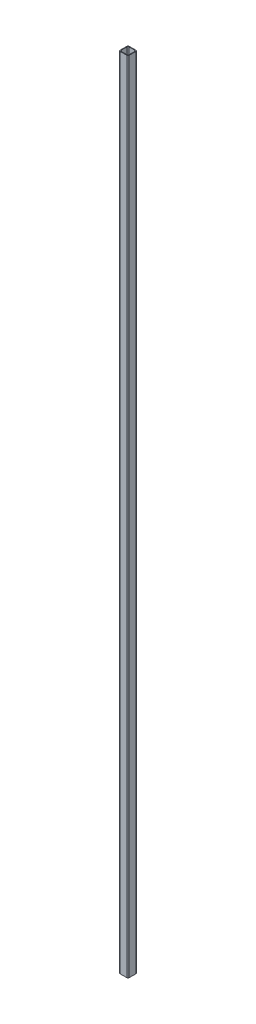
ISO-10303-21;
HEADER;
FILE_DESCRIPTION(('STEP AP214'),'2;1');
FILE_NAME('part.step','',(''),(''),'','','');
FILE_SCHEMA(('AUTOMOTIVE_DESIGN { 1 0 10303 214 1 1 1 1 }'));
ENDSEC;
DATA;
#1=APPLICATION_CONTEXT('core data for automotive mechanical design processes');
#2=APPLICATION_PROTOCOL_DEFINITION('international standard','automotive_design',2000,#1);
#3=PRODUCT_CONTEXT('',#1,'mechanical');
#4=PRODUCT('Part','Part','',(#3));
#5=PRODUCT_RELATED_PRODUCT_CATEGORY('part','',(#4));
#6=PRODUCT_DEFINITION_FORMATION('','',#4);
#7=PRODUCT_DEFINITION_CONTEXT('part definition',#1,'design');
#8=PRODUCT_DEFINITION('design','',#6,#7);
#9=PRODUCT_DEFINITION_SHAPE('','',#8);
#10=(LENGTH_UNIT() NAMED_UNIT(*) SI_UNIT(.MILLI.,.METRE.));
#11=(NAMED_UNIT(*) PLANE_ANGLE_UNIT() SI_UNIT($,.RADIAN.));
#12=(NAMED_UNIT(*) SI_UNIT($,.STERADIAN.) SOLID_ANGLE_UNIT());
#13=UNCERTAINTY_MEASURE_WITH_UNIT(LENGTH_MEASURE(1.E-05),#10,'distance_accuracy_value','');
#14=(GEOMETRIC_REPRESENTATION_CONTEXT(3) GLOBAL_UNCERTAINTY_ASSIGNED_CONTEXT((#13)) GLOBAL_UNIT_ASSIGNED_CONTEXT((#10,
#11,#12)) REPRESENTATION_CONTEXT('',''));
#15=CARTESIAN_POINT('',(0.,0.,0.));
#16=DIRECTION('',(0.,0.,1.));
#17=DIRECTION('',(1.,0.,0.));
#18=AXIS2_PLACEMENT_3D('',#15,#16,#17);
#19=CARTESIAN_POINT('',(-3.,715.,-3.));
#20=DIRECTION('',(0.,-1.,0.));
#21=DIRECTION('',(0.,0.,1.));
#22=AXIS2_PLACEMENT_3D('',#19,#20,#21);
#23=PLANE('',#22);
#24=CARTESIAN_POINT('',(-3.,715.,-3.));
#25=DIRECTION('',(0.,-1.,0.));
#26=DIRECTION('',(0.,0.,1.));
#27=AXIS2_PLACEMENT_3D('',#24,#25,#26);
#28=CIRCLE('',#27,1.);
#29=CARTESIAN_POINT('',(-4.,715.,-3.));
#30=VERTEX_POINT('',#29);
#31=CARTESIAN_POINT('',(-3.,715.,-4.));
#32=VERTEX_POINT('',#31);
#33=EDGE_CURVE('E217',#30,#32,#28,.T.);
#34=ORIENTED_EDGE('',*,*,#33,.F.);
#35=DIRECTION('',(0.,0.,-1.));
#36=VECTOR('',#35,1.);
#37=CARTESIAN_POINT('',(-4.,715.,-3.));
#38=LINE('',#37,#36);
#39=CARTESIAN_POINT('',(-4.,715.,3.));
#40=VERTEX_POINT('',#39);
#41=EDGE_CURVE('E239',#40,#30,#38,.T.);
#42=ORIENTED_EDGE('',*,*,#41,.F.);
#43=CARTESIAN_POINT('',(-3.,715.,3.));
#44=DIRECTION('',(0.,-1.,0.));
#45=DIRECTION('',(0.,0.,1.));
#46=AXIS2_PLACEMENT_3D('',#43,#44,#45);
#47=CIRCLE('',#46,1.);
#48=CARTESIAN_POINT('',(-3.,715.,4.));
#49=VERTEX_POINT('',#48);
#50=EDGE_CURVE('E236',#49,#40,#47,.T.);
#51=ORIENTED_EDGE('',*,*,#50,.F.);
#52=DIRECTION('',(-1.,0.,0.));
#53=VECTOR('',#52,1.);
#54=CARTESIAN_POINT('',(-3.,715.,4.));
#55=LINE('',#54,#53);
#56=CARTESIAN_POINT('',(3.,715.,4.));
#57=VERTEX_POINT('',#56);
#58=EDGE_CURVE('E233',#57,#49,#55,.T.);
#59=ORIENTED_EDGE('',*,*,#58,.F.);
#60=CARTESIAN_POINT('',(3.,715.,3.));
#61=DIRECTION('',(0.,-1.,0.));
#62=DIRECTION('',(0.,0.,1.));
#63=AXIS2_PLACEMENT_3D('',#60,#61,#62);
#64=CIRCLE('',#63,1.);
#65=CARTESIAN_POINT('',(4.,715.,3.));
#66=VERTEX_POINT('',#65);
#67=EDGE_CURVE('E230',#66,#57,#64,.T.);
#68=ORIENTED_EDGE('',*,*,#67,.F.);
#69=DIRECTION('',(0.,0.,1.));
#70=VECTOR('',#69,1.);
#71=CARTESIAN_POINT('',(4.,715.,-3.));
#72=LINE('',#71,#70);
#73=CARTESIAN_POINT('',(4.,715.,-3.));
#74=VERTEX_POINT('',#73);
#75=EDGE_CURVE('E227',#74,#66,#72,.T.);
#76=ORIENTED_EDGE('',*,*,#75,.F.);
#77=CARTESIAN_POINT('',(3.,715.,-3.));
#78=DIRECTION('',(0.,-1.,0.));
#79=DIRECTION('',(0.,0.,-1.));
#80=AXIS2_PLACEMENT_3D('',#77,#78,#79);
#81=CIRCLE('',#80,1.);
#82=CARTESIAN_POINT('',(3.,715.,-4.));
#83=VERTEX_POINT('',#82);
#84=EDGE_CURVE('E224',#83,#74,#81,.T.);
#85=ORIENTED_EDGE('',*,*,#84,.F.);
#86=DIRECTION('',(1.,0.,0.));
#87=VECTOR('',#86,1.);
#88=CARTESIAN_POINT('',(-3.,715.,-4.));
#89=LINE('',#88,#87);
#90=EDGE_CURVE('E220',#32,#83,#89,.T.);
#91=ORIENTED_EDGE('',*,*,#90,.F.);
#92=EDGE_LOOP('',(#34,#42,#51,#59,#68,#76,#85,#91));
#93=FACE_BOUND('',#92,.T.);
#94=CARTESIAN_POINT('',(-2.5,715.,-2.5));
#95=DIRECTION('',(0.,-1.,0.));
#96=DIRECTION('',(0.,0.,1.));
#97=AXIS2_PLACEMENT_3D('',#94,#95,#96);
#98=CIRCLE('',#97,1.);
#99=CARTESIAN_POINT('',(-3.5,715.,-2.5));
#100=VERTEX_POINT('',#99);
#101=CARTESIAN_POINT('',(-2.5,715.,-3.5));
#102=VERTEX_POINT('',#101);
#103=EDGE_CURVE('E152',#100,#102,#98,.T.);
#104=ORIENTED_EDGE('',*,*,#103,.T.);
#105=DIRECTION('',(1.,0.,0.));
#106=VECTOR('',#105,1.);
#107=CARTESIAN_POINT('',(-2.5,715.,-3.5));
#108=LINE('',#107,#106);
#109=CARTESIAN_POINT('',(2.5,715.,-3.5));
#110=VERTEX_POINT('',#109);
#111=EDGE_CURVE('E161',#102,#110,#108,.T.);
#112=ORIENTED_EDGE('',*,*,#111,.T.);
#113=CARTESIAN_POINT('',(2.5,715.,-2.5));
#114=DIRECTION('',(0.,-1.,0.));
#115=DIRECTION('',(0.,0.,-1.));
#116=AXIS2_PLACEMENT_3D('',#113,#114,#115);
#117=CIRCLE('',#116,1.);
#118=CARTESIAN_POINT('',(3.5,715.,-2.5));
#119=VERTEX_POINT('',#118);
#120=EDGE_CURVE('E166',#110,#119,#117,.T.);
#121=ORIENTED_EDGE('',*,*,#120,.T.);
#122=DIRECTION('',(0.,0.,1.));
#123=VECTOR('',#122,1.);
#124=CARTESIAN_POINT('',(3.5,715.,-2.5));
#125=LINE('',#124,#123);
#126=CARTESIAN_POINT('',(3.5,715.,2.5));
#127=VERTEX_POINT('',#126);
#128=EDGE_CURVE('E178',#119,#127,#125,.T.);
#129=ORIENTED_EDGE('',*,*,#128,.T.);
#130=CARTESIAN_POINT('',(2.5,715.,2.5));
#131=DIRECTION('',(0.,-1.,0.));
#132=DIRECTION('',(0.,0.,1.));
#133=AXIS2_PLACEMENT_3D('',#130,#131,#132);
#134=CIRCLE('',#133,1.);
#135=CARTESIAN_POINT('',(2.5,715.,3.5));
#136=VERTEX_POINT('',#135);
#137=EDGE_CURVE('E181',#127,#136,#134,.T.);
#138=ORIENTED_EDGE('',*,*,#137,.T.);
#139=DIRECTION('',(-1.,0.,0.));
#140=VECTOR('',#139,1.);
#141=CARTESIAN_POINT('',(-2.5,715.,3.5));
#142=LINE('',#141,#140);
#143=CARTESIAN_POINT('',(-2.5,715.,3.5));
#144=VERTEX_POINT('',#143);
#145=EDGE_CURVE('E184',#136,#144,#142,.T.);
#146=ORIENTED_EDGE('',*,*,#145,.T.);
#147=CARTESIAN_POINT('',(-2.5,715.,2.5));
#148=DIRECTION('',(0.,-1.,0.));
#149=DIRECTION('',(0.,0.,1.));
#150=AXIS2_PLACEMENT_3D('',#147,#148,#149);
#151=CIRCLE('',#150,1.);
#152=CARTESIAN_POINT('',(-3.5,715.,2.5));
#153=VERTEX_POINT('',#152);
#154=EDGE_CURVE('E187',#144,#153,#151,.T.);
#155=ORIENTED_EDGE('',*,*,#154,.T.);
#156=DIRECTION('',(0.,0.,-1.));
#157=VECTOR('',#156,1.);
#158=CARTESIAN_POINT('',(-3.5,715.,-2.5));
#159=LINE('',#158,#157);
#160=EDGE_CURVE('E170',#153,#100,#159,.T.);
#161=ORIENTED_EDGE('',*,*,#160,.T.);
#162=EDGE_LOOP('',(#104,#112,#121,#129,#138,#146,#155,#161));
#163=FACE_BOUND('',#162,.T.);
#164=ADVANCED_FACE('F37',(#93,#163),#23,.F.);
#165=CARTESIAN_POINT('',(-3.,0.,-3.));
#166=DIRECTION('',(0.,-1.,0.));
#167=DIRECTION('',(0.,0.,1.));
#168=AXIS2_PLACEMENT_3D('',#165,#166,#167);
#169=PLANE('',#168);
#170=CARTESIAN_POINT('',(-3.,0.,-3.));
#171=DIRECTION('',(0.,-1.,0.));
#172=DIRECTION('',(0.,0.,1.));
#173=AXIS2_PLACEMENT_3D('',#170,#171,#172);
#174=CIRCLE('',#173,1.);
#175=CARTESIAN_POINT('',(-4.,0.,-3.));
#176=VERTEX_POINT('',#175);
#177=CARTESIAN_POINT('',(-3.,0.,-4.));
#178=VERTEX_POINT('',#177);
#179=EDGE_CURVE('E157',#176,#178,#174,.T.);
#180=ORIENTED_EDGE('',*,*,#179,.T.);
#181=DIRECTION('',(1.,0.,0.));
#182=VECTOR('',#181,1.);
#183=CARTESIAN_POINT('',(-3.,0.,-4.));
#184=LINE('',#183,#182);
#185=CARTESIAN_POINT('',(3.,0.,-4.));
#186=VERTEX_POINT('',#185);
#187=EDGE_CURVE('E245',#178,#186,#184,.T.);
#188=ORIENTED_EDGE('',*,*,#187,.T.);
#189=CARTESIAN_POINT('',(3.,0.,-3.));
#190=DIRECTION('',(0.,-1.,0.));
#191=DIRECTION('',(0.,0.,-1.));
#192=AXIS2_PLACEMENT_3D('',#189,#190,#191);
#193=CIRCLE('',#192,1.);
#194=CARTESIAN_POINT('',(4.,0.,-3.));
#195=VERTEX_POINT('',#194);
#196=EDGE_CURVE('E248',#186,#195,#193,.T.);
#197=ORIENTED_EDGE('',*,*,#196,.T.);
#198=DIRECTION('',(0.,0.,1.));
#199=VECTOR('',#198,1.);
#200=CARTESIAN_POINT('',(4.,0.,-3.));
#201=LINE('',#200,#199);
#202=CARTESIAN_POINT('',(4.,0.,3.));
#203=VERTEX_POINT('',#202);
#204=EDGE_CURVE('E251',#195,#203,#201,.T.);
#205=ORIENTED_EDGE('',*,*,#204,.T.);
#206=CARTESIAN_POINT('',(3.,0.,3.));
#207=DIRECTION('',(0.,-1.,0.));
#208=DIRECTION('',(0.,0.,1.));
#209=AXIS2_PLACEMENT_3D('',#206,#207,#208);
#210=CIRCLE('',#209,1.);
#211=CARTESIAN_POINT('',(3.,0.,4.));
#212=VERTEX_POINT('',#211);
#213=EDGE_CURVE('E254',#203,#212,#210,.T.);
#214=ORIENTED_EDGE('',*,*,#213,.T.);
#215=DIRECTION('',(-1.,0.,0.));
#216=VECTOR('',#215,1.);
#217=CARTESIAN_POINT('',(-3.,0.,4.));
#218=LINE('',#217,#216);
#219=CARTESIAN_POINT('',(-3.,0.,4.));
#220=VERTEX_POINT('',#219);
#221=EDGE_CURVE('E257',#212,#220,#218,.T.);
#222=ORIENTED_EDGE('',*,*,#221,.T.);
#223=CARTESIAN_POINT('',(-3.,0.,3.));
#224=DIRECTION('',(0.,-1.,0.));
#225=DIRECTION('',(0.,0.,1.));
#226=AXIS2_PLACEMENT_3D('',#223,#224,#225);
#227=CIRCLE('',#226,1.);
#228=CARTESIAN_POINT('',(-4.,0.,3.));
#229=VERTEX_POINT('',#228);
#230=EDGE_CURVE('E260',#220,#229,#227,.T.);
#231=ORIENTED_EDGE('',*,*,#230,.T.);
#232=DIRECTION('',(0.,0.,-1.));
#233=VECTOR('',#232,1.);
#234=CARTESIAN_POINT('',(-4.,0.,-3.));
#235=LINE('',#234,#233);
#236=EDGE_CURVE('E221',#229,#176,#235,.T.);
#237=ORIENTED_EDGE('',*,*,#236,.T.);
#238=EDGE_LOOP('',(#180,#188,#197,#205,#214,#222,#231,#237));
#239=FACE_BOUND('',#238,.T.);
#240=DIRECTION('',(0.,0.,-1.));
#241=VECTOR('',#240,1.);
#242=CARTESIAN_POINT('',(-3.5,0.,-2.5));
#243=LINE('',#242,#241);
#244=CARTESIAN_POINT('',(-3.5,0.,2.5));
#245=VERTEX_POINT('',#244);
#246=CARTESIAN_POINT('',(-3.5,0.,-2.5));
#247=VERTEX_POINT('',#246);
#248=EDGE_CURVE('E171',#245,#247,#243,.T.);
#249=ORIENTED_EDGE('',*,*,#248,.F.);
#250=CARTESIAN_POINT('',(-2.5,0.,2.5));
#251=DIRECTION('',(0.,-1.,0.));
#252=DIRECTION('',(0.,0.,1.));
#253=AXIS2_PLACEMENT_3D('',#250,#251,#252);
#254=CIRCLE('',#253,1.);
#255=CARTESIAN_POINT('',(-2.5,0.,3.5));
#256=VERTEX_POINT('',#255);
#257=EDGE_CURVE('E174',#256,#245,#254,.T.);
#258=ORIENTED_EDGE('',*,*,#257,.F.);
#259=DIRECTION('',(-1.,0.,0.));
#260=VECTOR('',#259,1.);
#261=CARTESIAN_POINT('',(-2.5,0.,3.5));
#262=LINE('',#261,#260);
#263=CARTESIAN_POINT('',(2.5,0.,3.5));
#264=VERTEX_POINT('',#263);
#265=EDGE_CURVE('E202',#264,#256,#262,.T.);
#266=ORIENTED_EDGE('',*,*,#265,.F.);
#267=CARTESIAN_POINT('',(2.5,0.,2.5));
#268=DIRECTION('',(0.,-1.,0.));
#269=DIRECTION('',(0.,0.,1.));
#270=AXIS2_PLACEMENT_3D('',#267,#268,#269);
#271=CIRCLE('',#270,1.);
#272=CARTESIAN_POINT('',(3.5,0.,2.5));
#273=VERTEX_POINT('',#272);
#274=EDGE_CURVE('E199',#273,#264,#271,.T.);
#275=ORIENTED_EDGE('',*,*,#274,.F.);
#276=DIRECTION('',(0.,0.,1.));
#277=VECTOR('',#276,1.);
#278=CARTESIAN_POINT('',(3.5,0.,-2.5));
#279=LINE('',#278,#277);
#280=CARTESIAN_POINT('',(3.5,0.,-2.5));
#281=VERTEX_POINT('',#280);
#282=EDGE_CURVE('E196',#281,#273,#279,.T.);
#283=ORIENTED_EDGE('',*,*,#282,.F.);
#284=CARTESIAN_POINT('',(2.5,0.,-2.5));
#285=DIRECTION('',(0.,-1.,0.));
#286=DIRECTION('',(0.,0.,-1.));
#287=AXIS2_PLACEMENT_3D('',#284,#285,#286);
#288=CIRCLE('',#287,1.);
#289=CARTESIAN_POINT('',(2.5,0.,-3.5));
#290=VERTEX_POINT('',#289);
#291=EDGE_CURVE('E193',#290,#281,#288,.T.);
#292=ORIENTED_EDGE('',*,*,#291,.F.);
#293=DIRECTION('',(1.,0.,0.));
#294=VECTOR('',#293,1.);
#295=CARTESIAN_POINT('',(-2.5,0.,-3.5));
#296=LINE('',#295,#294);
#297=CARTESIAN_POINT('',(-2.5,0.,-3.5));
#298=VERTEX_POINT('',#297);
#299=EDGE_CURVE('E191',#298,#290,#296,.T.);
#300=ORIENTED_EDGE('',*,*,#299,.F.);
#301=CARTESIAN_POINT('',(-2.5,0.,-2.5));
#302=DIRECTION('',(0.,-1.,0.));
#303=DIRECTION('',(0.,0.,1.));
#304=AXIS2_PLACEMENT_3D('',#301,#302,#303);
#305=CIRCLE('',#304,1.);
#306=EDGE_CURVE('E153',#247,#298,#305,.T.);
#307=ORIENTED_EDGE('',*,*,#306,.F.);
#308=EDGE_LOOP('',(#249,#258,#266,#275,#283,#292,#300,#307));
#309=FACE_BOUND('',#308,.T.);
#310=ADVANCED_FACE('F285',(#239,#309),#169,.T.);
#311=CARTESIAN_POINT('',(-3.,715.,-3.));
#312=DIRECTION('',(0.,-1.,0.));
#313=DIRECTION('',(0.,0.,1.));
#314=AXIS2_PLACEMENT_3D('',#311,#312,#313);
#315=CYLINDRICAL_SURFACE('',#314,1.);
#316=ORIENTED_EDGE('',*,*,#179,.F.);
#317=DIRECTION('',(0.,-1.,0.));
#318=VECTOR('',#317,1.);
#319=CARTESIAN_POINT('',(-4.,715.,-3.));
#320=LINE('',#319,#318);
#321=EDGE_CURVE('E242',#30,#176,#320,.T.);
#322=ORIENTED_EDGE('',*,*,#321,.F.);
#323=ORIENTED_EDGE('',*,*,#33,.T.);
#324=DIRECTION('',(0.,-1.,0.));
#325=VECTOR('',#324,1.);
#326=CARTESIAN_POINT('',(-3.,715.,-4.));
#327=LINE('',#326,#325);
#328=EDGE_CURVE('E11',#32,#178,#327,.T.);
#329=ORIENTED_EDGE('',*,*,#328,.T.);
#330=EDGE_LOOP('',(#316,#322,#323,#329));
#331=FACE_BOUND('',#330,.T.);
#332=ADVANCED_FACE('F39',(#331),#315,.T.);
#333=CARTESIAN_POINT('',(-3.,715.,-4.));
#334=DIRECTION('',(0.,0.,1.));
#335=DIRECTION('',(-1.,0.,0.));
#336=AXIS2_PLACEMENT_3D('',#333,#334,#335);
#337=PLANE('',#336);
#338=ORIENTED_EDGE('',*,*,#187,.F.);
#339=ORIENTED_EDGE('',*,*,#328,.F.);
#340=ORIENTED_EDGE('',*,*,#90,.T.);
#341=DIRECTION('',(0.,-1.,0.));
#342=VECTOR('',#341,1.);
#343=CARTESIAN_POINT('',(3.,715.,-4.));
#344=LINE('',#343,#342);
#345=EDGE_CURVE('E45',#83,#186,#344,.T.);
#346=ORIENTED_EDGE('',*,*,#345,.T.);
#347=EDGE_LOOP('',(#338,#339,#340,#346));
#348=FACE_BOUND('',#347,.T.);
#349=ADVANCED_FACE('F278',(#348),#337,.F.);
#350=CARTESIAN_POINT('',(3.,715.,-3.));
#351=DIRECTION('',(0.,-1.,0.));
#352=DIRECTION('',(0.,0.,1.));
#353=AXIS2_PLACEMENT_3D('',#350,#351,#352);
#354=CYLINDRICAL_SURFACE('',#353,1.);
#355=ORIENTED_EDGE('',*,*,#196,.F.);
#356=ORIENTED_EDGE('',*,*,#345,.F.);
#357=ORIENTED_EDGE('',*,*,#84,.T.);
#358=DIRECTION('',(0.,-1.,0.));
#359=VECTOR('',#358,1.);
#360=CARTESIAN_POINT('',(4.,715.,-3.));
#361=LINE('',#360,#359);
#362=EDGE_CURVE('E274',#74,#195,#361,.T.);
#363=ORIENTED_EDGE('',*,*,#362,.T.);
#364=EDGE_LOOP('',(#355,#356,#357,#363));
#365=FACE_BOUND('',#364,.T.);
#366=ADVANCED_FACE('F282',(#365),#354,.T.);
#367=CARTESIAN_POINT('',(4.,715.,-3.));
#368=DIRECTION('',(-1.,0.,0.));
#369=DIRECTION('',(0.,0.,-1.));
#370=AXIS2_PLACEMENT_3D('',#367,#368,#369);
#371=PLANE('',#370);
#372=ORIENTED_EDGE('',*,*,#204,.F.);
#373=ORIENTED_EDGE('',*,*,#362,.F.);
#374=ORIENTED_EDGE('',*,*,#75,.T.);
#375=DIRECTION('',(0.,-1.,0.));
#376=VECTOR('',#375,1.);
#377=CARTESIAN_POINT('',(4.,715.,3.));
#378=LINE('',#377,#376);
#379=EDGE_CURVE('E272',#66,#203,#378,.T.);
#380=ORIENTED_EDGE('',*,*,#379,.T.);
#381=EDGE_LOOP('',(#372,#373,#374,#380));
#382=FACE_BOUND('',#381,.T.);
#383=ADVANCED_FACE('F297',(#382),#371,.F.);
#384=CARTESIAN_POINT('',(3.,715.,3.));
#385=DIRECTION('',(0.,-1.,0.));
#386=DIRECTION('',(0.,0.,1.));
#387=AXIS2_PLACEMENT_3D('',#384,#385,#386);
#388=CYLINDRICAL_SURFACE('',#387,1.);
#389=ORIENTED_EDGE('',*,*,#213,.F.);
#390=ORIENTED_EDGE('',*,*,#379,.F.);
#391=ORIENTED_EDGE('',*,*,#67,.T.);
#392=DIRECTION('',(0.,-1.,0.));
#393=VECTOR('',#392,1.);
#394=CARTESIAN_POINT('',(3.,715.,4.));
#395=LINE('',#394,#393);
#396=EDGE_CURVE('E270',#57,#212,#395,.T.);
#397=ORIENTED_EDGE('',*,*,#396,.T.);
#398=EDGE_LOOP('',(#389,#390,#391,#397));
#399=FACE_BOUND('',#398,.T.);
#400=ADVANCED_FACE('F301',(#399),#388,.T.);
#401=CARTESIAN_POINT('',(-3.,715.,4.));
#402=DIRECTION('',(0.,0.,-1.));
#403=DIRECTION('',(1.,0.,0.));
#404=AXIS2_PLACEMENT_3D('',#401,#402,#403);
#405=PLANE('',#404);
#406=ORIENTED_EDGE('',*,*,#221,.F.);
#407=ORIENTED_EDGE('',*,*,#396,.F.);
#408=ORIENTED_EDGE('',*,*,#58,.T.);
#409=DIRECTION('',(0.,-1.,0.));
#410=VECTOR('',#409,1.);
#411=CARTESIAN_POINT('',(-3.,715.,4.));
#412=LINE('',#411,#410);
#413=EDGE_CURVE('E268',#49,#220,#412,.T.);
#414=ORIENTED_EDGE('',*,*,#413,.T.);
#415=EDGE_LOOP('',(#406,#407,#408,#414));
#416=FACE_BOUND('',#415,.T.);
#417=ADVANCED_FACE('F303',(#416),#405,.F.);
#418=CARTESIAN_POINT('',(-3.,715.,3.));
#419=DIRECTION('',(0.,-1.,0.));
#420=DIRECTION('',(0.,0.,1.));
#421=AXIS2_PLACEMENT_3D('',#418,#419,#420);
#422=CYLINDRICAL_SURFACE('',#421,1.);
#423=ORIENTED_EDGE('',*,*,#230,.F.);
#424=ORIENTED_EDGE('',*,*,#413,.F.);
#425=ORIENTED_EDGE('',*,*,#50,.T.);
#426=DIRECTION('',(0.,-1.,0.));
#427=VECTOR('',#426,1.);
#428=CARTESIAN_POINT('',(-4.,715.,3.));
#429=LINE('',#428,#427);
#430=EDGE_CURVE('E266',#40,#229,#429,.T.);
#431=ORIENTED_EDGE('',*,*,#430,.T.);
#432=EDGE_LOOP('',(#423,#424,#425,#431));
#433=FACE_BOUND('',#432,.T.);
#434=ADVANCED_FACE('F307',(#433),#422,.T.);
#435=CARTESIAN_POINT('',(-4.,715.,-3.));
#436=DIRECTION('',(1.,0.,0.));
#437=DIRECTION('',(0.,0.,1.));
#438=AXIS2_PLACEMENT_3D('',#435,#436,#437);
#439=PLANE('',#438);
#440=ORIENTED_EDGE('',*,*,#236,.F.);
#441=ORIENTED_EDGE('',*,*,#430,.F.);
#442=ORIENTED_EDGE('',*,*,#41,.T.);
#443=ORIENTED_EDGE('',*,*,#321,.T.);
#444=EDGE_LOOP('',(#440,#441,#442,#443));
#445=FACE_BOUND('',#444,.T.);
#446=ADVANCED_FACE('F309',(#445),#439,.F.);
#447=CARTESIAN_POINT('',(-2.5,715.,-2.5));
#448=DIRECTION('',(0.,-1.,0.));
#449=DIRECTION('',(0.,0.,1.));
#450=AXIS2_PLACEMENT_3D('',#447,#448,#449);
#451=CYLINDRICAL_SURFACE('',#450,1.);
#452=ORIENTED_EDGE('',*,*,#306,.T.);
#453=DIRECTION('',(0.,-1.,0.));
#454=VECTOR('',#453,1.);
#455=CARTESIAN_POINT('',(-2.5,715.,-3.5));
#456=LINE('',#455,#454);
#457=EDGE_CURVE('E148',#102,#298,#456,.T.);
#458=ORIENTED_EDGE('',*,*,#457,.F.);
#459=ORIENTED_EDGE('',*,*,#103,.F.);
#460=DIRECTION('',(0.,-1.,0.));
#461=VECTOR('',#460,1.);
#462=CARTESIAN_POINT('',(-3.5,715.,-2.5));
#463=LINE('',#462,#461);
#464=EDGE_CURVE('E60',#100,#247,#463,.T.);
#465=ORIENTED_EDGE('',*,*,#464,.T.);
#466=EDGE_LOOP('',(#452,#458,#459,#465));
#467=FACE_BOUND('',#466,.T.);
#468=ADVANCED_FACE('F150',(#467),#451,.F.);
#469=CARTESIAN_POINT('',(-2.5,715.,-3.5));
#470=DIRECTION('',(0.,0.,1.));
#471=DIRECTION('',(-1.,0.,0.));
#472=AXIS2_PLACEMENT_3D('',#469,#470,#471);
#473=PLANE('',#472);
#474=ORIENTED_EDGE('',*,*,#299,.T.);
#475=DIRECTION('',(0.,-1.,0.));
#476=VECTOR('',#475,1.);
#477=CARTESIAN_POINT('',(2.5,715.,-3.5));
#478=LINE('',#477,#476);
#479=EDGE_CURVE('E158',#110,#290,#478,.T.);
#480=ORIENTED_EDGE('',*,*,#479,.F.);
#481=ORIENTED_EDGE('',*,*,#111,.F.);
#482=ORIENTED_EDGE('',*,*,#457,.T.);
#483=EDGE_LOOP('',(#474,#480,#481,#482));
#484=FACE_BOUND('',#483,.T.);
#485=ADVANCED_FACE('F162',(#484),#473,.T.);
#486=CARTESIAN_POINT('',(2.5,715.,-2.5));
#487=DIRECTION('',(0.,-1.,0.));
#488=DIRECTION('',(0.,0.,1.));
#489=AXIS2_PLACEMENT_3D('',#486,#487,#488);
#490=CYLINDRICAL_SURFACE('',#489,1.);
#491=ORIENTED_EDGE('',*,*,#291,.T.);
#492=DIRECTION('',(0.,-1.,0.));
#493=VECTOR('',#492,1.);
#494=CARTESIAN_POINT('',(3.5,715.,-2.5));
#495=LINE('',#494,#493);
#496=EDGE_CURVE('E214',#119,#281,#495,.T.);
#497=ORIENTED_EDGE('',*,*,#496,.F.);
#498=ORIENTED_EDGE('',*,*,#120,.F.);
#499=ORIENTED_EDGE('',*,*,#479,.T.);
#500=EDGE_LOOP('',(#491,#497,#498,#499));
#501=FACE_BOUND('',#500,.T.);
#502=ADVANCED_FACE('F327',(#501),#490,.F.);
#503=CARTESIAN_POINT('',(3.5,715.,-2.5));
#504=DIRECTION('',(-1.,0.,0.));
#505=DIRECTION('',(0.,0.,-1.));
#506=AXIS2_PLACEMENT_3D('',#503,#504,#505);
#507=PLANE('',#506);
#508=ORIENTED_EDGE('',*,*,#282,.T.);
#509=DIRECTION('',(0.,-1.,0.));
#510=VECTOR('',#509,1.);
#511=CARTESIAN_POINT('',(3.5,715.,2.5));
#512=LINE('',#511,#510);
#513=EDGE_CURVE('E212',#127,#273,#512,.T.);
#514=ORIENTED_EDGE('',*,*,#513,.F.);
#515=ORIENTED_EDGE('',*,*,#128,.F.);
#516=ORIENTED_EDGE('',*,*,#496,.T.);
#517=EDGE_LOOP('',(#508,#514,#515,#516));
#518=FACE_BOUND('',#517,.T.);
#519=ADVANCED_FACE('F330',(#518),#507,.T.);
#520=CARTESIAN_POINT('',(2.5,715.,2.5));
#521=DIRECTION('',(0.,-1.,0.));
#522=DIRECTION('',(0.,0.,1.));
#523=AXIS2_PLACEMENT_3D('',#520,#521,#522);
#524=CYLINDRICAL_SURFACE('',#523,1.);
#525=ORIENTED_EDGE('',*,*,#274,.T.);
#526=DIRECTION('',(0.,-1.,0.));
#527=VECTOR('',#526,1.);
#528=CARTESIAN_POINT('',(2.5,715.,3.5));
#529=LINE('',#528,#527);
#530=EDGE_CURVE('E210',#136,#264,#529,.T.);
#531=ORIENTED_EDGE('',*,*,#530,.F.);
#532=ORIENTED_EDGE('',*,*,#137,.F.);
#533=ORIENTED_EDGE('',*,*,#513,.T.);
#534=EDGE_LOOP('',(#525,#531,#532,#533));
#535=FACE_BOUND('',#534,.T.);
#536=ADVANCED_FACE('F334',(#535),#524,.F.);
#537=CARTESIAN_POINT('',(-2.5,715.,3.5));
#538=DIRECTION('',(0.,0.,-1.));
#539=DIRECTION('',(1.,0.,0.));
#540=AXIS2_PLACEMENT_3D('',#537,#538,#539);
#541=PLANE('',#540);
#542=ORIENTED_EDGE('',*,*,#265,.T.);
#543=DIRECTION('',(0.,-1.,0.));
#544=VECTOR('',#543,1.);
#545=CARTESIAN_POINT('',(-2.5,715.,3.5));
#546=LINE('',#545,#544);
#547=EDGE_CURVE('E208',#144,#256,#546,.T.);
#548=ORIENTED_EDGE('',*,*,#547,.F.);
#549=ORIENTED_EDGE('',*,*,#145,.F.);
#550=ORIENTED_EDGE('',*,*,#530,.T.);
#551=EDGE_LOOP('',(#542,#548,#549,#550));
#552=FACE_BOUND('',#551,.T.);
#553=ADVANCED_FACE('F338',(#552),#541,.T.);
#554=CARTESIAN_POINT('',(-2.5,715.,2.5));
#555=DIRECTION('',(0.,-1.,0.));
#556=DIRECTION('',(0.,0.,1.));
#557=AXIS2_PLACEMENT_3D('',#554,#555,#556);
#558=CYLINDRICAL_SURFACE('',#557,1.);
#559=ORIENTED_EDGE('',*,*,#257,.T.);
#560=DIRECTION('',(0.,-1.,0.));
#561=VECTOR('',#560,1.);
#562=CARTESIAN_POINT('',(-3.5,715.,2.5));
#563=LINE('',#562,#561);
#564=EDGE_CURVE('E52',#153,#245,#563,.T.);
#565=ORIENTED_EDGE('',*,*,#564,.F.);
#566=ORIENTED_EDGE('',*,*,#154,.F.);
#567=ORIENTED_EDGE('',*,*,#547,.T.);
#568=EDGE_LOOP('',(#559,#565,#566,#567));
#569=FACE_BOUND('',#568,.T.);
#570=ADVANCED_FACE('F342',(#569),#558,.F.);
#571=CARTESIAN_POINT('',(-3.5,715.,-2.5));
#572=DIRECTION('',(1.,0.,0.));
#573=DIRECTION('',(0.,0.,1.));
#574=AXIS2_PLACEMENT_3D('',#571,#572,#573);
#575=PLANE('',#574);
#576=ORIENTED_EDGE('',*,*,#248,.T.);
#577=ORIENTED_EDGE('',*,*,#464,.F.);
#578=ORIENTED_EDGE('',*,*,#160,.F.);
#579=ORIENTED_EDGE('',*,*,#564,.T.);
#580=EDGE_LOOP('',(#576,#577,#578,#579));
#581=FACE_BOUND('',#580,.T.);
#582=ADVANCED_FACE('F346',(#581),#575,.T.);
#583=CLOSED_SHELL('',(#164,#310,#332,#349,#366,#383,#400,#417,#434,#446,#468,#485,#502,#519,
#536,#553,#570,#582));
#584=MANIFOLD_SOLID_BREP('B2',#583);
#585=ADVANCED_BREP_SHAPE_REPRESENTATION('',(#18,#584),#14);
#586=SHAPE_DEFINITION_REPRESENTATION(#9,#585);
ENDSEC;
END-ISO-10303-21;
